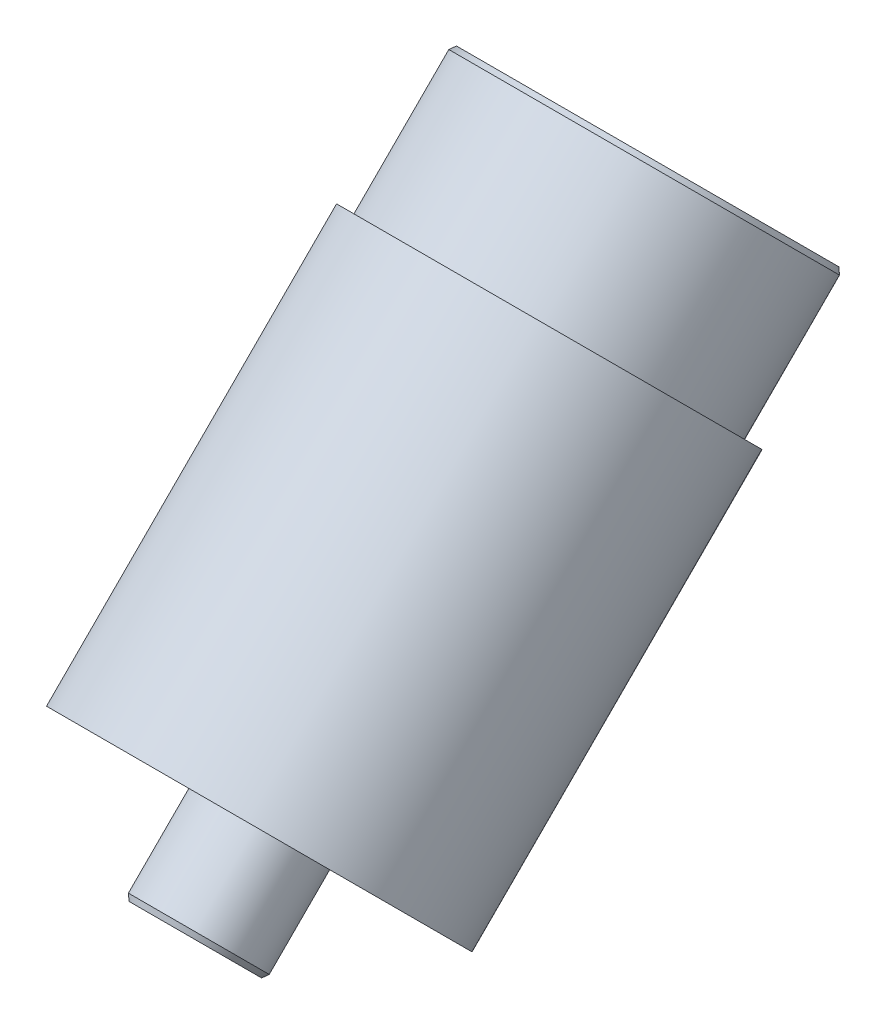
ISO-10303-21;
HEADER;
FILE_DESCRIPTION(('STEP AP214'),'2;1');
FILE_NAME('part.step','',(''),(''),'','','');
FILE_SCHEMA(('AUTOMOTIVE_DESIGN { 1 0 10303 214 1 1 1 1 }'));
ENDSEC;
DATA;
#1=APPLICATION_CONTEXT('core data for automotive mechanical design processes');
#2=APPLICATION_PROTOCOL_DEFINITION('international standard','automotive_design',2000,#1);
#3=PRODUCT_CONTEXT('',#1,'mechanical');
#4=PRODUCT('Part','Part','',(#3));
#5=PRODUCT_RELATED_PRODUCT_CATEGORY('part','',(#4));
#6=PRODUCT_DEFINITION_FORMATION('','',#4);
#7=PRODUCT_DEFINITION_CONTEXT('part definition',#1,'design');
#8=PRODUCT_DEFINITION('design','',#6,#7);
#9=PRODUCT_DEFINITION_SHAPE('','',#8);
#10=(LENGTH_UNIT() NAMED_UNIT(*) SI_UNIT(.MILLI.,.METRE.));
#11=(NAMED_UNIT(*) PLANE_ANGLE_UNIT() SI_UNIT($,.RADIAN.));
#12=(NAMED_UNIT(*) SI_UNIT($,.STERADIAN.) SOLID_ANGLE_UNIT());
#13=UNCERTAINTY_MEASURE_WITH_UNIT(LENGTH_MEASURE(1.E-05),#10,'distance_accuracy_value','');
#14=(GEOMETRIC_REPRESENTATION_CONTEXT(3) GLOBAL_UNCERTAINTY_ASSIGNED_CONTEXT((#13)) GLOBAL_UNIT_ASSIGNED_CONTEXT((#10,
#11,#12)) REPRESENTATION_CONTEXT('',''));
#15=CARTESIAN_POINT('',(0.,0.,0.));
#16=DIRECTION('',(0.,0.,1.));
#17=DIRECTION('',(1.,0.,0.));
#18=AXIS2_PLACEMENT_3D('',#15,#16,#17);
#19=CARTESIAN_POINT('',(0.,-40.7208308084375,40.7208308084377));
#20=DIRECTION('',(0.,0.707106781186546,-0.707106781186549));
#21=DIRECTION('',(0.,0.707106781186549,0.707106781186546));
#22=AXIS2_PLACEMENT_3D('',#19,#20,#21);
#23=CYLINDRICAL_SURFACE('',#22,23.);
#24=CARTESIAN_POINT('',(0.,-37.8924036836913,37.8924036836915));
#25=DIRECTION('',(0.,-0.707106781186546,0.707106781186549));
#26=DIRECTION('',(0.,-0.707106781186549,-0.707106781186546));
#27=AXIS2_PLACEMENT_3D('',#24,#25,#26);
#28=CIRCLE('',#27,23.);
#29=CARTESIAN_POINT('',(0.,-54.1558596509819,21.6289477164009));
#30=VERTEX_POINT('',#29);
#31=EDGE_CURVE('E109',#30,#30,#28,.F.);
#32=ORIENTED_EDGE('',*,*,#31,.F.);
#33=EDGE_LOOP('',(#32));
#34=FACE_BOUND('',#33,.T.);
#35=CARTESIAN_POINT('',(0.,-9.60813243622943,9.60813243622948));
#36=DIRECTION('',(0.,0.707106781186546,-0.707106781186549));
#37=DIRECTION('',(0.,0.707106781186549,0.707106781186546));
#38=AXIS2_PLACEMENT_3D('',#35,#36,#37);
#39=CIRCLE('',#38,23.);
#40=CARTESIAN_POINT('',(0.,6.6553235310612,25.87158840352));
#41=VERTEX_POINT('',#40);
#42=EDGE_CURVE('E119',#41,#41,#39,.F.);
#43=ORIENTED_EDGE('',*,*,#42,.F.);
#44=EDGE_LOOP('',(#43));
#45=FACE_BOUND('',#44,.T.);
#46=ADVANCED_FACE('F41',(#34,#45),#23,.F.);
#47=CARTESIAN_POINT('',(0.,-47.0847918391164,47.0847918391166));
#48=DIRECTION('',(0.,-0.707106781186546,0.707106781186549));
#49=DIRECTION('',(0.,-0.707106781186549,-0.707106781186546));
#50=AXIS2_PLACEMENT_3D('',#47,#48,#49);
#51=PLANE('',#50);
#52=CARTESIAN_POINT('',(0.,-47.0847918391164,47.0847918391166));
#53=DIRECTION('',(0.,-0.707106781186546,0.707106781186549));
#54=DIRECTION('',(0.,-0.707106781186549,-0.707106781186546));
#55=AXIS2_PLACEMENT_3D('',#52,#53,#54);
#56=CIRCLE('',#55,2.54);
#57=CARTESIAN_POINT('',(2.01990098767242,-45.9958473960891,48.1737362821439));
#58=VERTEX_POINT('',#57);
#59=CARTESIAN_POINT('',(-2.01990098767242,-45.9958473960891,48.1737362821439));
#60=VERTEX_POINT('',#59);
#61=EDGE_CURVE('E97',#58,#60,#56,.T.);
#62=ORIENTED_EDGE('',*,*,#61,.T.);
#63=DIRECTION('',(1.,0.,0.));
#64=VECTOR('',#63,1.);
#65=CARTESIAN_POINT('',(0.,-45.9958473960891,48.1737362821439));
#66=LINE('',#65,#64);
#67=EDGE_CURVE('E84',#60,#58,#66,.T.);
#68=ORIENTED_EDGE('',*,*,#67,.T.);
#69=EDGE_LOOP('',(#62,#68));
#70=FACE_BOUND('',#69,.T.);
#71=ADVANCED_FACE('F144',(#70),#51,.T.);
#72=CARTESIAN_POINT('',(0.,-40.7208308084375,40.7208308084377));
#73=DIRECTION('',(0.,0.707106781186546,-0.707106781186549));
#74=DIRECTION('',(0.,0.707106781186549,0.707106781186546));
#75=AXIS2_PLACEMENT_3D('',#72,#73,#74);
#76=CYLINDRICAL_SURFACE('',#75,25.);
#77=CARTESIAN_POINT('',(0.,0.998469281568749,-0.998469281568754));
#78=DIRECTION('',(0.,0.707106781186546,-0.707106781186549));
#79=DIRECTION('',(0.,0.707106781186549,0.707106781186546));
#80=AXIS2_PLACEMENT_3D('',#77,#78,#79);
#81=CIRCLE('',#80,25.);
#82=CARTESIAN_POINT('',(0.,18.6761388112325,16.6792002480949));
#83=VERTEX_POINT('',#82);
#84=EDGE_CURVE('E103',#83,#83,#81,.T.);
#85=ORIENTED_EDGE('',*,*,#84,.F.);
#86=EDGE_LOOP('',(#85));
#87=FACE_BOUND('',#86,.T.);
#88=CARTESIAN_POINT('',(0.,-40.7208308084375,40.7208308084377));
#89=DIRECTION('',(0.,0.707106781186546,-0.707106781186549));
#90=DIRECTION('',(0.,0.707106781186549,0.707106781186546));
#91=AXIS2_PLACEMENT_3D('',#88,#89,#90);
#92=CIRCLE('',#91,25.);
#93=CARTESIAN_POINT('',(0.,-23.0431612787737,58.3985003381013));
#94=VERTEX_POINT('',#93);
#95=EDGE_CURVE('E113',#94,#94,#92,.T.);
#96=ORIENTED_EDGE('',*,*,#95,.T.);
#97=EDGE_LOOP('',(#96));
#98=FACE_BOUND('',#97,.T.);
#99=ADVANCED_FACE('F155',(#87,#98),#76,.T.);
#100=CARTESIAN_POINT('',(0.,-40.7208308084375,40.7208308084377));
#101=DIRECTION('',(0.,0.707106781186546,-0.707106781186549));
#102=DIRECTION('',(0.,0.707106781186549,0.707106781186546));
#103=AXIS2_PLACEMENT_3D('',#100,#101,#102);
#104=PLANE('',#103);
#105=CARTESIAN_POINT('',(0.,-40.7208308084374,40.7208308084377));
#106=DIRECTION('',(0.,-0.707106781186546,0.707106781186549));
#107=DIRECTION('',(0.,-0.707106781186549,-0.707106781186546));
#108=AXIS2_PLACEMENT_3D('',#105,#106,#107);
#109=CIRCLE('',#108,8.275);
#110=CARTESIAN_POINT('',(0.,-46.5721394227561,34.869522194119));
#111=VERTEX_POINT('',#110);
#112=EDGE_CURVE('E82',#111,#111,#109,.T.);
#113=ORIENTED_EDGE('',*,*,#112,.F.);
#114=EDGE_LOOP('',(#113));
#115=FACE_BOUND('',#114,.T.);
#116=ORIENTED_EDGE('',*,*,#95,.F.);
#117=EDGE_LOOP('',(#116));
#118=FACE_BOUND('',#117,.T.);
#119=ADVANCED_FACE('F163',(#115,#118),#104,.F.);
#120=CARTESIAN_POINT('',(0.,0.998469281568749,-0.998469281568754));
#121=DIRECTION('',(0.,0.707106781186546,-0.707106781186549));
#122=DIRECTION('',(0.,0.707106781186549,0.707106781186546));
#123=AXIS2_PLACEMENT_3D('',#120,#121,#122);
#124=PLANE('',#123);
#125=CARTESIAN_POINT('',(0.,0.998469281568749,-0.998469281568754));
#126=DIRECTION('',(0.,0.707106781186546,-0.707106781186549));
#127=DIRECTION('',(0.,0.707106781186549,0.707106781186546));
#128=AXIS2_PLACEMENT_3D('',#125,#126,#127);
#129=CIRCLE('',#128,22.95);
#130=CARTESIAN_POINT('',(0.,17.2265699098001,15.2296313466625));
#131=VERTEX_POINT('',#130);
#132=EDGE_CURVE('E123',#131,#131,#129,.T.);
#133=ORIENTED_EDGE('',*,*,#132,.F.);
#134=EDGE_LOOP('',(#133));
#135=FACE_BOUND('',#134,.T.);
#136=ORIENTED_EDGE('',*,*,#84,.T.);
#137=EDGE_LOOP('',(#136));
#138=FACE_BOUND('',#137,.T.);
#139=ADVANCED_FACE('F157',(#135,#138),#124,.T.);
#140=CARTESIAN_POINT('',(0.,-37.8924036836913,37.8924036836915));
#141=DIRECTION('',(0.,-0.707106781186546,0.707106781186549));
#142=DIRECTION('',(0.,-0.707106781186549,-0.707106781186546));
#143=AXIS2_PLACEMENT_3D('',#140,#141,#142);
#144=PLANE('',#143);
#145=DIRECTION('',(1.,0.,0.));
#146=VECTOR('',#145,1.);
#147=CARTESIAN_POINT('',(0.,-36.803459240664,38.9813481267187));
#148=LINE('',#147,#146);
#149=CARTESIAN_POINT('',(-2.01990098767242,-36.803459240664,38.9813481267187));
#150=VERTEX_POINT('',#149);
#151=CARTESIAN_POINT('',(2.01990098767242,-36.803459240664,38.9813481267187));
#152=VERTEX_POINT('',#151);
#153=EDGE_CURVE('E207',#150,#152,#148,.T.);
#154=ORIENTED_EDGE('',*,*,#153,.F.);
#155=CARTESIAN_POINT('',(0.,-37.8924036836913,37.8924036836915));
#156=DIRECTION('',(0.,-0.707106781186546,0.707106781186549));
#157=DIRECTION('',(0.,-0.707106781186549,-0.707106781186546));
#158=AXIS2_PLACEMENT_3D('',#155,#156,#157);
#159=CIRCLE('',#158,2.54);
#160=CARTESIAN_POINT('',(-2.01990098767241,-38.9813481267186,36.8034592406642));
#161=VERTEX_POINT('',#160);
#162=EDGE_CURVE('E101',#150,#161,#159,.T.);
#163=ORIENTED_EDGE('',*,*,#162,.T.);
#164=DIRECTION('',(1.,0.,0.));
#165=VECTOR('',#164,1.);
#166=CARTESIAN_POINT('',(0.,-38.9813481267186,36.8034592406642));
#167=LINE('',#166,#165);
#168=CARTESIAN_POINT('',(2.01990098767241,-38.9813481267186,36.8034592406642));
#169=VERTEX_POINT('',#168);
#170=EDGE_CURVE('E205',#161,#169,#167,.T.);
#171=ORIENTED_EDGE('',*,*,#170,.T.);
#172=CARTESIAN_POINT('',(0.,-37.8924036836913,37.8924036836915));
#173=DIRECTION('',(0.,-0.707106781186546,0.707106781186549));
#174=DIRECTION('',(0.,-0.707106781186549,-0.707106781186546));
#175=AXIS2_PLACEMENT_3D('',#172,#173,#174);
#176=CIRCLE('',#175,2.54);
#177=EDGE_CURVE('E95',#169,#152,#176,.T.);
#178=ORIENTED_EDGE('',*,*,#177,.T.);
#179=EDGE_LOOP('',(#154,#163,#171,#178));
#180=FACE_BOUND('',#179,.T.);
#181=ORIENTED_EDGE('',*,*,#31,.T.);
#182=EDGE_LOOP('',(#181));
#183=FACE_BOUND('',#182,.T.);
#184=ADVANCED_FACE('F177',(#180,#183),#144,.F.);
#185=CARTESIAN_POINT('',(0.,-49.9132189638625,49.9132189638628));
#186=DIRECTION('',(0.,0.707106781186546,-0.707106781186549));
#187=DIRECTION('',(0.,0.707106781186549,0.707106781186546));
#188=AXIS2_PLACEMENT_3D('',#185,#186,#187);
#189=CYLINDRICAL_SURFACE('',#188,8.275);
#190=CARTESIAN_POINT('',(0.,-49.418244217032,49.4182442170323));
#191=DIRECTION('',(0.,-0.707106781186548,0.707106781186548));
#192=DIRECTION('',(0.,-0.707106781186548,-0.707106781186548));
#193=AXIS2_PLACEMENT_3D('',#190,#191,#192);
#194=CIRCLE('',#193,8.275);
#195=CARTESIAN_POINT('',(0.,-55.2695528313507,43.5669356027136));
#196=VERTEX_POINT('',#195);
#197=EDGE_CURVE('E11',#196,#196,#194,.F.);
#198=ORIENTED_EDGE('',*,*,#197,.T.);
#199=EDGE_LOOP('',(#198));
#200=FACE_BOUND('',#199,.T.);
#201=ORIENTED_EDGE('',*,*,#112,.T.);
#202=EDGE_LOOP('',(#201));
#203=FACE_BOUND('',#202,.T.);
#204=ADVANCED_FACE('F184',(#200,#203),#189,.T.);
#205=CARTESIAN_POINT('',(0.,-49.9132189638625,49.9132189638628));
#206=DIRECTION('',(0.,-0.707106781186546,0.707106781186549));
#207=DIRECTION('',(0.,-0.707106781186549,-0.707106781186546));
#208=AXIS2_PLACEMENT_3D('',#205,#206,#207);
#209=PLANE('',#208);
#210=CARTESIAN_POINT('',(0.,-49.9132189638625,49.9132189638628));
#211=DIRECTION('',(0.,-0.707106781186546,0.707106781186549));
#212=DIRECTION('',(0.,-0.707106781186549,-0.707106781186546));
#213=AXIS2_PLACEMENT_3D('',#210,#211,#212);
#214=CIRCLE('',#213,7.78485472325325);
#215=CARTESIAN_POINT('',(0.,-55.4179425292271,44.4084953984983));
#216=VERTEX_POINT('',#215);
#217=EDGE_CURVE('E49',#216,#216,#214,.T.);
#218=ORIENTED_EDGE('',*,*,#217,.T.);
#219=EDGE_LOOP('',(#218));
#220=FACE_BOUND('',#219,.T.);
#221=CARTESIAN_POINT('',(0.,-49.9132189638626,49.9132189638628));
#222=DIRECTION('',(0.,-0.707106781186546,0.707106781186549));
#223=DIRECTION('',(0.,-0.707106781186549,-0.707106781186546));
#224=AXIS2_PLACEMENT_3D('',#221,#222,#223);
#225=CIRCLE('',#224,2.54);
#226=CARTESIAN_POINT('',(0.,-51.7092701880764,48.117167739649));
#227=VERTEX_POINT('',#226);
#228=EDGE_CURVE('E96',#227,#227,#225,.T.);
#229=ORIENTED_EDGE('',*,*,#228,.F.);
#230=EDGE_LOOP('',(#229));
#231=FACE_BOUND('',#230,.T.);
#232=ADVANCED_FACE('F127',(#220,#231),#209,.T.);
#233=CARTESIAN_POINT('',(0.,-47.0847918391164,47.0847918391166));
#234=DIRECTION('',(0.,-0.707106781186546,0.707106781186549));
#235=DIRECTION('',(0.,-0.707106781186549,-0.707106781186546));
#236=AXIS2_PLACEMENT_3D('',#233,#234,#235);
#237=CYLINDRICAL_SURFACE('',#236,2.54);
#238=ORIENTED_EDGE('',*,*,#228,.T.);
#239=EDGE_LOOP('',(#238));
#240=FACE_BOUND('',#239,.T.);
#241=CARTESIAN_POINT('',(-2.01990098767242,-48.1737362821437,45.9958473960893));
#242=VERTEX_POINT('',#241);
#243=CARTESIAN_POINT('',(2.01990098767241,-48.1737362821437,45.9958473960893));
#244=VERTEX_POINT('',#243);
#245=EDGE_CURVE('E87',#242,#244,#56,.T.);
#246=ORIENTED_EDGE('',*,*,#245,.F.);
#247=DIRECTION('',(0.,-0.707106781186546,0.707106781186549));
#248=VECTOR('',#247,1.);
#249=CARTESIAN_POINT('',(-2.01990098767241,-20.5965718158684,18.4186829298139));
#250=LINE('',#249,#248);
#251=EDGE_CURVE('E65',#161,#242,#250,.T.);
#252=ORIENTED_EDGE('',*,*,#251,.F.);
#253=ORIENTED_EDGE('',*,*,#162,.F.);
#254=DIRECTION('',(0.,-0.707106781186546,0.707106781186549));
#255=VECTOR('',#254,1.);
#256=CARTESIAN_POINT('',(-2.01990098767242,-18.4186829298138,20.5965718158685));
#257=LINE('',#256,#255);
#258=EDGE_CURVE('E197',#150,#60,#257,.T.);
#259=ORIENTED_EDGE('',*,*,#258,.T.);
#260=ORIENTED_EDGE('',*,*,#61,.F.);
#261=DIRECTION('',(0.,-0.707106781186546,0.707106781186549));
#262=VECTOR('',#261,1.);
#263=CARTESIAN_POINT('',(2.01990098767242,-18.4186829298138,20.5965718158685));
#264=LINE('',#263,#262);
#265=EDGE_CURVE('E92',#152,#58,#264,.T.);
#266=ORIENTED_EDGE('',*,*,#265,.F.);
#267=ORIENTED_EDGE('',*,*,#177,.F.);
#268=DIRECTION('',(0.,-0.707106781186546,0.707106781186549));
#269=VECTOR('',#268,1.);
#270=CARTESIAN_POINT('',(2.01990098767241,-20.5965718158684,18.4186829298139));
#271=LINE('',#270,#269);
#272=EDGE_CURVE('E60',#169,#244,#271,.T.);
#273=ORIENTED_EDGE('',*,*,#272,.T.);
#274=EDGE_LOOP('',(#246,#252,#253,#259,#260,#266,#267,#273));
#275=FACE_BOUND('',#274,.T.);
#276=ADVANCED_FACE('F86',(#240,#275),#237,.F.);
#277=DIRECTION('',(1.,0.,0.));
#278=VECTOR('',#277,1.);
#279=CARTESIAN_POINT('',(0.,-48.1737362821437,45.9958473960893));
#280=LINE('',#279,#278);
#281=EDGE_CURVE('E79',#242,#244,#280,.T.);
#282=ORIENTED_EDGE('',*,*,#281,.F.);
#283=ORIENTED_EDGE('',*,*,#245,.T.);
#284=EDGE_LOOP('',(#282,#283));
#285=FACE_BOUND('',#284,.T.);
#286=ADVANCED_FACE('F98',(#285),#51,.T.);
#287=CARTESIAN_POINT('',(-2.01990098767242,-18.4186829298138,20.5965718158685));
#288=DIRECTION('',(0.,-0.707106781186549,-0.707106781186546));
#289=DIRECTION('',(0.,0.707106781186546,-0.707106781186549));
#290=AXIS2_PLACEMENT_3D('',#287,#288,#289);
#291=PLANE('',#290);
#292=ORIENTED_EDGE('',*,*,#153,.T.);
#293=ORIENTED_EDGE('',*,*,#265,.T.);
#294=ORIENTED_EDGE('',*,*,#67,.F.);
#295=ORIENTED_EDGE('',*,*,#258,.F.);
#296=EDGE_LOOP('',(#292,#293,#294,#295));
#297=FACE_BOUND('',#296,.T.);
#298=ADVANCED_FACE('F211',(#297),#291,.T.);
#299=CARTESIAN_POINT('',(-2.01990098767241,-20.5965718158684,18.4186829298139));
#300=DIRECTION('',(0.,-0.707106781186549,-0.707106781186546));
#301=DIRECTION('',(0.,0.707106781186546,-0.707106781186549));
#302=AXIS2_PLACEMENT_3D('',#299,#300,#301);
#303=PLANE('',#302);
#304=ORIENTED_EDGE('',*,*,#251,.T.);
#305=ORIENTED_EDGE('',*,*,#281,.T.);
#306=ORIENTED_EDGE('',*,*,#272,.F.);
#307=ORIENTED_EDGE('',*,*,#170,.F.);
#308=EDGE_LOOP('',(#304,#305,#306,#307));
#309=FACE_BOUND('',#308,.T.);
#310=ADVANCED_FACE('F78',(#309),#303,.F.);
#311=CARTESIAN_POINT('',(0.,-9.60813243622944,9.60813243622948));
#312=DIRECTION('',(0.,0.707106781186546,-0.707106781186549));
#313=DIRECTION('',(0.,0.707106781186549,0.707106781186546));
#314=AXIS2_PLACEMENT_3D('',#311,#312,#313);
#315=PLANE('',#314);
#316=ORIENTED_EDGE('',*,*,#42,.T.);
#317=EDGE_LOOP('',(#316));
#318=FACE_BOUND('',#317,.T.);
#319=CARTESIAN_POINT('',(0.,-9.60813243622944,9.60813243622948));
#320=DIRECTION('',(0.,0.707106781186546,-0.707106781186549));
#321=DIRECTION('',(0.,0.707106781186549,0.707106781186546));
#322=AXIS2_PLACEMENT_3D('',#319,#320,#321);
#323=CIRCLE('',#322,21.);
#324=CARTESIAN_POINT('',(0.,5.2411099686881,24.4573748411469));
#325=VERTEX_POINT('',#324);
#326=EDGE_CURVE('E198',#325,#325,#323,.T.);
#327=ORIENTED_EDGE('',*,*,#326,.T.);
#328=EDGE_LOOP('',(#327));
#329=FACE_BOUND('',#328,.T.);
#330=ADVANCED_FACE('F217',(#318,#329),#315,.F.);
#331=CARTESIAN_POINT('',(0.,-9.60813243622944,9.60813243622948));
#332=DIRECTION('',(0.,0.707106781186546,-0.707106781186549));
#333=DIRECTION('',(0.,0.707106781186549,0.707106781186546));
#334=AXIS2_PLACEMENT_3D('',#331,#332,#333);
#335=CYLINDRICAL_SURFACE('',#334,21.);
#336=ORIENTED_EDGE('',*,*,#326,.F.);
#337=EDGE_LOOP('',(#336));
#338=FACE_BOUND('',#337,.T.);
#339=CARTESIAN_POINT('',(0.,15.1406049052997,-15.1406049052997));
#340=DIRECTION('',(0.,0.707106781186546,-0.707106781186549));
#341=DIRECTION('',(0.,0.707106781186549,0.707106781186546));
#342=AXIS2_PLACEMENT_3D('',#339,#340,#341);
#343=CIRCLE('',#342,21.);
#344=CARTESIAN_POINT('',(0.,29.9898473102172,-0.291362500382277));
#345=VERTEX_POINT('',#344);
#346=EDGE_CURVE('E192',#345,#345,#343,.T.);
#347=ORIENTED_EDGE('',*,*,#346,.T.);
#348=EDGE_LOOP('',(#347));
#349=FACE_BOUND('',#348,.T.);
#350=ADVANCED_FACE('F292',(#338,#349),#335,.F.);
#351=CARTESIAN_POINT('',(0.,-9.60813243622944,9.60813243622948));
#352=DIRECTION('',(0.,0.707106781186546,-0.707106781186549));
#353=DIRECTION('',(0.,0.707106781186549,0.707106781186546));
#354=AXIS2_PLACEMENT_3D('',#351,#352,#353);
#355=CYLINDRICAL_SURFACE('',#354,22.95);
#356=CARTESIAN_POINT('',(0.,14.6456301584691,-14.6456301584691));
#357=DIRECTION('',(0.,0.707106781186547,-0.707106781186547));
#358=DIRECTION('',(0.,0.707106781186548,0.707106781186548));
#359=AXIS2_PLACEMENT_3D('',#356,#357,#358);
#360=CIRCLE('',#359,22.95);
#361=CARTESIAN_POINT('',(0.,30.8737307867003,1.58247046976214));
#362=VERTEX_POINT('',#361);
#363=EDGE_CURVE('E121',#362,#362,#360,.F.);
#364=ORIENTED_EDGE('',*,*,#363,.T.);
#365=EDGE_LOOP('',(#364));
#366=FACE_BOUND('',#365,.T.);
#367=ORIENTED_EDGE('',*,*,#132,.T.);
#368=EDGE_LOOP('',(#367));
#369=FACE_BOUND('',#368,.T.);
#370=ADVANCED_FACE('F288',(#366,#369),#355,.T.);
#371=CARTESIAN_POINT('',(0.,15.1406049052997,-15.1406049052997));
#372=DIRECTION('',(0.,0.707106781186546,-0.707106781186549));
#373=DIRECTION('',(0.,0.707106781186549,0.707106781186546));
#374=AXIS2_PLACEMENT_3D('',#371,#372,#373);
#375=PLANE('',#374);
#376=CARTESIAN_POINT('',(0.,15.1406049052997,-15.1406049052997));
#377=DIRECTION('',(0.,0.707106781186546,-0.707106781186549));
#378=DIRECTION('',(0.,0.707106781186549,0.707106781186546));
#379=AXIS2_PLACEMENT_3D('',#376,#377,#378);
#380=CIRCLE('',#379,22.4598547232531);
#381=CARTESIAN_POINT('',(0.,31.0221204845767,0.740910673977234));
#382=VERTEX_POINT('',#381);
#383=EDGE_CURVE('E122',#382,#382,#380,.T.);
#384=ORIENTED_EDGE('',*,*,#383,.T.);
#385=EDGE_LOOP('',(#384));
#386=FACE_BOUND('',#385,.T.);
#387=ORIENTED_EDGE('',*,*,#346,.F.);
#388=EDGE_LOOP('',(#387));
#389=FACE_BOUND('',#388,.T.);
#390=ADVANCED_FACE('F139',(#386,#389),#375,.T.);
#391=CARTESIAN_POINT('',(0.,15.1406049052997,-15.1406049052997));
#392=DIRECTION('',(0.,-0.707106781186547,0.707106781186547));
#393=DIRECTION('',(0.,-0.707106781186548,-0.707106781186548));
#394=AXIS2_PLACEMENT_3D('',#391,#392,#393);
#395=CONICAL_SURFACE('',#394,22.4598547232532,0.610865238198);
#396=ORIENTED_EDGE('',*,*,#363,.F.);
#397=EDGE_LOOP('',(#396));
#398=FACE_BOUND('',#397,.T.);
#399=ORIENTED_EDGE('',*,*,#383,.F.);
#400=EDGE_LOOP('',(#399));
#401=FACE_BOUND('',#400,.T.);
#402=ADVANCED_FACE('F132',(#398,#401),#395,.T.);
#403=CARTESIAN_POINT('',(0.,-49.9132189638625,49.9132189638628));
#404=DIRECTION('',(0.,0.707106781186548,-0.707106781186548));
#405=DIRECTION('',(0.,0.707106781186548,0.707106781186548));
#406=AXIS2_PLACEMENT_3D('',#403,#404,#405);
#407=CONICAL_SURFACE('',#406,7.78485472325327,0.610865238198013);
#408=ORIENTED_EDGE('',*,*,#197,.F.);
#409=EDGE_LOOP('',(#408));
#410=FACE_BOUND('',#409,.T.);
#411=ORIENTED_EDGE('',*,*,#217,.F.);
#412=EDGE_LOOP('',(#411));
#413=FACE_BOUND('',#412,.T.);
#414=ADVANCED_FACE('F42',(#410,#413),#407,.T.);
#415=CLOSED_SHELL('',(#46,#71,#99,#119,#139,#184,#204,#232,#276,#286,#298,#310,#330,#350,#370,
#390,#402,#414));
#416=MANIFOLD_SOLID_BREP('B2',#415);
#417=ADVANCED_BREP_SHAPE_REPRESENTATION('',(#18,#416),#14);
#418=SHAPE_DEFINITION_REPRESENTATION(#9,#417);
ENDSEC;
END-ISO-10303-21;
